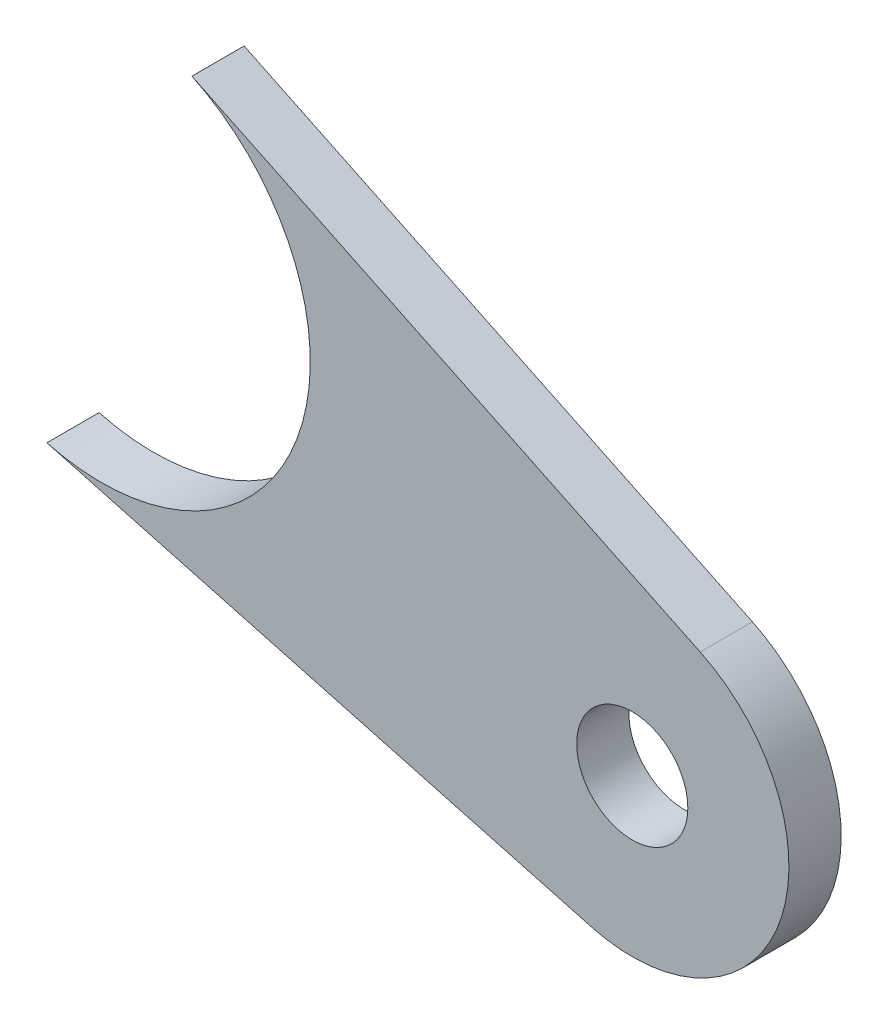
ISO-10303-21;
HEADER;
FILE_DESCRIPTION(('STEP AP214'),'2;1');
FILE_NAME('part.step','',(''),(''),'','','');
FILE_SCHEMA(('AUTOMOTIVE_DESIGN { 1 0 10303 214 1 1 1 1 }'));
ENDSEC;
DATA;
#1=APPLICATION_CONTEXT('core data for automotive mechanical design processes');
#2=APPLICATION_PROTOCOL_DEFINITION('international standard','automotive_design',2000,#1);
#3=PRODUCT_CONTEXT('',#1,'mechanical');
#4=PRODUCT('Part','Part','',(#3));
#5=PRODUCT_RELATED_PRODUCT_CATEGORY('part','',(#4));
#6=PRODUCT_DEFINITION_FORMATION('','',#4);
#7=PRODUCT_DEFINITION_CONTEXT('part definition',#1,'design');
#8=PRODUCT_DEFINITION('design','',#6,#7);
#9=PRODUCT_DEFINITION_SHAPE('','',#8);
#10=(LENGTH_UNIT() NAMED_UNIT(*) SI_UNIT(.MILLI.,.METRE.));
#11=(NAMED_UNIT(*) PLANE_ANGLE_UNIT() SI_UNIT($,.RADIAN.));
#12=(NAMED_UNIT(*) SI_UNIT($,.STERADIAN.) SOLID_ANGLE_UNIT());
#13=UNCERTAINTY_MEASURE_WITH_UNIT(LENGTH_MEASURE(1.E-05),#10,'distance_accuracy_value','');
#14=(GEOMETRIC_REPRESENTATION_CONTEXT(3) GLOBAL_UNCERTAINTY_ASSIGNED_CONTEXT((#13)) GLOBAL_UNIT_ASSIGNED_CONTEXT((#10,
#11,#12)) REPRESENTATION_CONTEXT('',''));
#15=CARTESIAN_POINT('',(0.,0.,0.));
#16=DIRECTION('',(0.,0.,1.));
#17=DIRECTION('',(1.,0.,0.));
#18=AXIS2_PLACEMENT_3D('',#15,#16,#17);
#19=CARTESIAN_POINT('',(-133.836857610211,12.0015109369361,3.175));
#20=DIRECTION('',(0.,0.,-1.));
#21=DIRECTION('',(-1.,0.,0.));
#22=AXIS2_PLACEMENT_3D('',#19,#20,#21);
#23=CYLINDRICAL_SURFACE('',#22,12.7);
#24=CARTESIAN_POINT('',(-133.836857610211,12.0015109369361,0.));
#25=DIRECTION('',(0.,0.,1.));
#26=DIRECTION('',(1.,0.,0.));
#27=AXIS2_PLACEMENT_3D('',#24,#25,#26);
#28=CIRCLE('',#27,12.7);
#29=CARTESIAN_POINT('',(-137.147060186481,-0.259506920650271,0.));
#30=VERTEX_POINT('',#29);
#31=CARTESIAN_POINT('',(-128.331370441501,23.4461433484718,0.));
#32=VERTEX_POINT('',#31);
#33=EDGE_CURVE('E108',#30,#32,#28,.T.);
#34=ORIENTED_EDGE('',*,*,#33,.F.);
#35=DIRECTION('',(0.,0.,-1.));
#36=VECTOR('',#35,1.);
#37=CARTESIAN_POINT('',(-137.147060186481,-0.259506920650271,3.175));
#38=LINE('',#37,#36);
#39=CARTESIAN_POINT('',(-137.147060186481,-0.259506920650271,3.175));
#40=VERTEX_POINT('',#39);
#41=EDGE_CURVE('E11',#40,#30,#38,.T.);
#42=ORIENTED_EDGE('',*,*,#41,.F.);
#43=CARTESIAN_POINT('',(-133.836857610211,12.0015109369361,3.175));
#44=DIRECTION('',(0.,0.,1.));
#45=DIRECTION('',(1.,0.,0.));
#46=AXIS2_PLACEMENT_3D('',#43,#44,#45);
#47=CIRCLE('',#46,12.7);
#48=CARTESIAN_POINT('',(-128.331370441501,23.4461433484718,3.175));
#49=VERTEX_POINT('',#48);
#50=EDGE_CURVE('E90',#40,#49,#47,.T.);
#51=ORIENTED_EDGE('',*,*,#50,.T.);
#52=DIRECTION('',(0.,0.,-1.));
#53=VECTOR('',#52,1.);
#54=CARTESIAN_POINT('',(-128.331370441501,23.4461433484718,3.175));
#55=LINE('',#54,#53);
#56=EDGE_CURVE('E57',#49,#32,#55,.T.);
#57=ORIENTED_EDGE('',*,*,#56,.T.);
#58=EDGE_LOOP('',(#34,#42,#51,#57));
#59=FACE_BOUND('',#58,.T.);
#60=ADVANCED_FACE('F41',(#59),#23,.F.);
#61=CARTESIAN_POINT('',(-9.38256121822789,-34.7530847420825,3.175));
#62=DIRECTION('',(0.260645872147286,0.965434476975305,0.));
#63=DIRECTION('',(-0.965434476975305,0.260645872147286,0.));
#64=AXIS2_PLACEMENT_3D('',#61,#62,#63);
#65=PLANE('',#64);
#66=DIRECTION('',(0.965434476975305,-0.260645872147286,0.));
#67=VECTOR('',#66,1.);
#68=CARTESIAN_POINT('',(-9.38256121822789,-34.7530847420825,0.));
#69=LINE('',#68,#67);
#70=CARTESIAN_POINT('',(-104.047091932203,-9.1957633931902,0.));
#71=VERTEX_POINT('',#70);
#72=EDGE_CURVE('E96',#30,#71,#69,.T.);
#73=ORIENTED_EDGE('',*,*,#72,.T.);
#74=DIRECTION('',(0.,0.,-1.));
#75=VECTOR('',#74,1.);
#76=CARTESIAN_POINT('',(-104.047091932203,-9.1957633931902,3.175));
#77=LINE('',#76,#75);
#78=CARTESIAN_POINT('',(-104.047091932203,-9.1957633931902,3.175));
#79=VERTEX_POINT('',#78);
#80=EDGE_CURVE('E49',#79,#71,#77,.T.);
#81=ORIENTED_EDGE('',*,*,#80,.F.);
#82=DIRECTION('',(0.965434476975305,-0.260645872147286,0.));
#83=VECTOR('',#82,1.);
#84=CARTESIAN_POINT('',(-9.38256121822789,-34.7530847420825,3.175));
#85=LINE('',#84,#83);
#86=EDGE_CURVE('E83',#40,#79,#85,.T.);
#87=ORIENTED_EDGE('',*,*,#86,.F.);
#88=ORIENTED_EDGE('',*,*,#41,.T.);
#89=EDGE_LOOP('',(#73,#81,#87,#88));
#90=FACE_BOUND('',#89,.T.);
#91=ADVANCED_FACE('F94',(#90),#65,.F.);
#92=CARTESIAN_POINT('',(-101.56444,0.,3.175));
#93=DIRECTION('',(0.,0.,-1.));
#94=DIRECTION('',(-1.,0.,0.));
#95=AXIS2_PLACEMENT_3D('',#92,#93,#94);
#96=CYLINDRICAL_SURFACE('',#95,9.52500000000046);
#97=CARTESIAN_POINT('',(-101.56444,0.,0.));
#98=DIRECTION('',(0.,0.,1.));
#99=DIRECTION('',(1.,0.,0.));
#100=AXIS2_PLACEMENT_3D('',#97,#98,#99);
#101=CIRCLE('',#100,9.52500000000046);
#102=CARTESIAN_POINT('',(-97.4353246234677,8.58347430865218,0.));
#103=VERTEX_POINT('',#102);
#104=EDGE_CURVE('E111',#71,#103,#101,.T.);
#105=ORIENTED_EDGE('',*,*,#104,.T.);
#106=DIRECTION('',(0.,0.,-1.));
#107=VECTOR('',#106,1.);
#108=CARTESIAN_POINT('',(-97.4353246234677,8.58347430865218,3.175));
#109=LINE('',#108,#107);
#110=CARTESIAN_POINT('',(-97.4353246234677,8.58347430865218,3.175));
#111=VERTEX_POINT('',#110);
#112=EDGE_CURVE('E71',#111,#103,#109,.T.);
#113=ORIENTED_EDGE('',*,*,#112,.F.);
#114=CARTESIAN_POINT('',(-101.56444,0.,3.175));
#115=DIRECTION('',(0.,0.,1.));
#116=DIRECTION('',(1.,0.,0.));
#117=AXIS2_PLACEMENT_3D('',#114,#115,#116);
#118=CIRCLE('',#117,9.52500000000046);
#119=EDGE_CURVE('E89',#79,#111,#118,.T.);
#120=ORIENTED_EDGE('',*,*,#119,.F.);
#121=ORIENTED_EDGE('',*,*,#80,.T.);
#122=EDGE_LOOP('',(#105,#113,#120,#121));
#123=FACE_BOUND('',#122,.T.);
#124=ADVANCED_FACE('F99',(#123),#96,.T.);
#125=CARTESIAN_POINT('',(-14.9573604210669,-31.0928872632509,3.175));
#126=DIRECTION('',(0.433502926670052,0.901152158388637,0.));
#127=DIRECTION('',(-0.901152158388637,0.433502926670052,0.));
#128=AXIS2_PLACEMENT_3D('',#125,#126,#127);
#129=PLANE('',#128);
#130=DIRECTION('',(0.901152158388637,-0.433502926670052,0.));
#131=VECTOR('',#130,1.);
#132=CARTESIAN_POINT('',(-14.9573604210669,-31.0928872632509,0.));
#133=LINE('',#132,#131);
#134=EDGE_CURVE('E113',#32,#103,#133,.T.);
#135=ORIENTED_EDGE('',*,*,#134,.F.);
#136=ORIENTED_EDGE('',*,*,#56,.F.);
#137=DIRECTION('',(0.901152158388637,-0.433502926670052,0.));
#138=VECTOR('',#137,1.);
#139=CARTESIAN_POINT('',(-14.9573604210669,-31.0928872632509,3.175));
#140=LINE('',#139,#138);
#141=EDGE_CURVE('E100',#49,#111,#140,.T.);
#142=ORIENTED_EDGE('',*,*,#141,.T.);
#143=ORIENTED_EDGE('',*,*,#112,.T.);
#144=EDGE_LOOP('',(#135,#136,#142,#143));
#145=FACE_BOUND('',#144,.T.);
#146=ADVANCED_FACE('F122',(#145),#129,.T.);
#147=CARTESIAN_POINT('',(-101.56444,0.,3.175));
#148=DIRECTION('',(0.,0.,-1.));
#149=DIRECTION('',(-1.,0.,0.));
#150=AXIS2_PLACEMENT_3D('',#147,#148,#149);
#151=CYLINDRICAL_SURFACE('',#150,3.37820000000004);
#152=CARTESIAN_POINT('',(-101.56444,0.,3.175));
#153=DIRECTION('',(0.,0.,1.));
#154=DIRECTION('',(1.,0.,0.));
#155=AXIS2_PLACEMENT_3D('',#152,#153,#154);
#156=CIRCLE('',#155,3.37820000000004);
#157=CARTESIAN_POINT('',(-98.1862400000001,0.,3.175));
#158=VERTEX_POINT('',#157);
#159=EDGE_CURVE('E102',#158,#158,#156,.T.);
#160=ORIENTED_EDGE('',*,*,#159,.T.);
#161=EDGE_LOOP('',(#160));
#162=FACE_BOUND('',#161,.T.);
#163=CARTESIAN_POINT('',(-101.56444,0.,0.));
#164=DIRECTION('',(0.,0.,1.));
#165=DIRECTION('',(1.,0.,0.));
#166=AXIS2_PLACEMENT_3D('',#163,#164,#165);
#167=CIRCLE('',#166,3.37820000000004);
#168=CARTESIAN_POINT('',(-98.1862400000001,0.,0.));
#169=VERTEX_POINT('',#168);
#170=EDGE_CURVE('E116',#169,#169,#167,.T.);
#171=ORIENTED_EDGE('',*,*,#170,.F.);
#172=EDGE_LOOP('',(#171));
#173=FACE_BOUND('',#172,.T.);
#174=ADVANCED_FACE('F124',(#162,#173),#151,.F.);
#175=CARTESIAN_POINT('',(0.,0.,3.175));
#176=DIRECTION('',(0.,0.,1.));
#177=DIRECTION('',(1.,0.,0.));
#178=AXIS2_PLACEMENT_3D('',#175,#176,#177);
#179=PLANE('',#178);
#180=ORIENTED_EDGE('',*,*,#50,.F.);
#181=ORIENTED_EDGE('',*,*,#86,.T.);
#182=ORIENTED_EDGE('',*,*,#119,.T.);
#183=ORIENTED_EDGE('',*,*,#141,.F.);
#184=EDGE_LOOP('',(#180,#181,#182,#183));
#185=FACE_BOUND('',#184,.T.);
#186=ORIENTED_EDGE('',*,*,#159,.F.);
#187=EDGE_LOOP('',(#186));
#188=FACE_BOUND('',#187,.T.);
#189=ADVANCED_FACE('F85',(#185,#188),#179,.T.);
#190=CARTESIAN_POINT('',(0.,0.,0.));
#191=DIRECTION('',(0.,0.,1.));
#192=DIRECTION('',(1.,0.,0.));
#193=AXIS2_PLACEMENT_3D('',#190,#191,#192);
#194=PLANE('',#193);
#195=ORIENTED_EDGE('',*,*,#33,.T.);
#196=ORIENTED_EDGE('',*,*,#134,.T.);
#197=ORIENTED_EDGE('',*,*,#104,.F.);
#198=ORIENTED_EDGE('',*,*,#72,.F.);
#199=EDGE_LOOP('',(#195,#196,#197,#198));
#200=FACE_BOUND('',#199,.T.);
#201=ORIENTED_EDGE('',*,*,#170,.T.);
#202=EDGE_LOOP('',(#201));
#203=FACE_BOUND('',#202,.T.);
#204=ADVANCED_FACE('F164',(#200,#203),#194,.F.);
#205=CLOSED_SHELL('',(#60,#91,#124,#146,#174,#189,#204));
#206=MANIFOLD_SOLID_BREP('B2',#205);
#207=ADVANCED_BREP_SHAPE_REPRESENTATION('',(#18,#206),#14);
#208=SHAPE_DEFINITION_REPRESENTATION(#9,#207);
ENDSEC;
END-ISO-10303-21;
